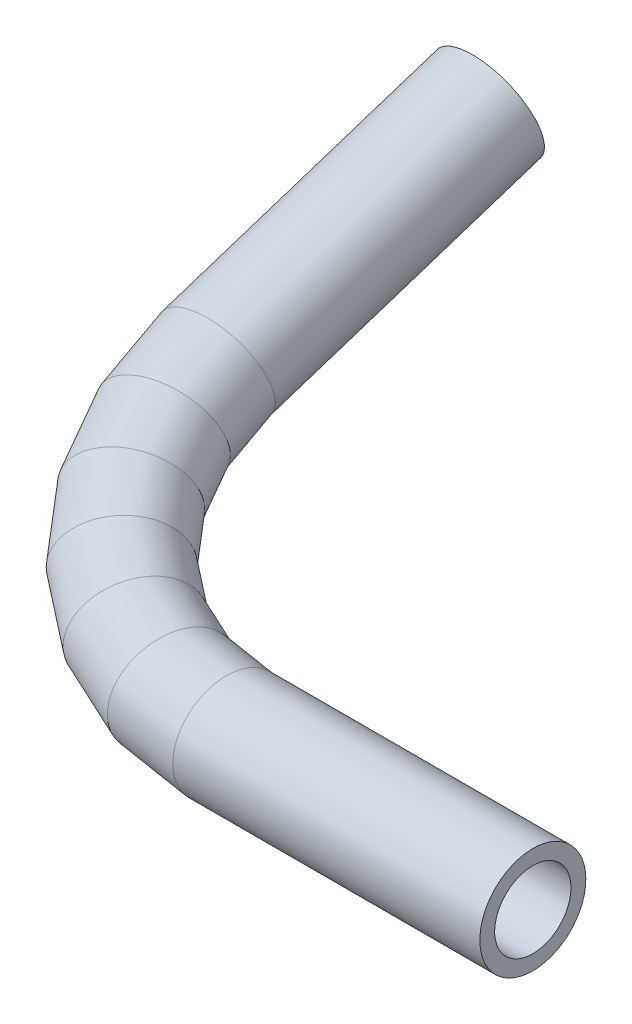
ISO-10303-21;
HEADER;
FILE_DESCRIPTION(('STEP AP214'),'2;1');
FILE_NAME('part.step','',(''),(''),'','','');
FILE_SCHEMA(('AUTOMOTIVE_DESIGN { 1 0 10303 214 1 1 1 1 }'));
ENDSEC;
DATA;
#1=APPLICATION_CONTEXT('core data for automotive mechanical design processes');
#2=APPLICATION_PROTOCOL_DEFINITION('international standard','automotive_design',2000,#1);
#3=PRODUCT_CONTEXT('',#1,'mechanical');
#4=PRODUCT('Part','Part','',(#3));
#5=PRODUCT_RELATED_PRODUCT_CATEGORY('part','',(#4));
#6=PRODUCT_DEFINITION_FORMATION('','',#4);
#7=PRODUCT_DEFINITION_CONTEXT('part definition',#1,'design');
#8=PRODUCT_DEFINITION('design','',#6,#7);
#9=PRODUCT_DEFINITION_SHAPE('','',#8);
#10=(LENGTH_UNIT() NAMED_UNIT(*) SI_UNIT(.MILLI.,.METRE.));
#11=(NAMED_UNIT(*) PLANE_ANGLE_UNIT() SI_UNIT($,.RADIAN.));
#12=(NAMED_UNIT(*) SI_UNIT($,.STERADIAN.) SOLID_ANGLE_UNIT());
#13=UNCERTAINTY_MEASURE_WITH_UNIT(LENGTH_MEASURE(1.E-05),#10,'distance_accuracy_value','');
#14=(GEOMETRIC_REPRESENTATION_CONTEXT(3) GLOBAL_UNCERTAINTY_ASSIGNED_CONTEXT((#13)) GLOBAL_UNIT_ASSIGNED_CONTEXT((#10,
#11,#12)) REPRESENTATION_CONTEXT('',''));
#15=CARTESIAN_POINT('',(0.,0.,0.));
#16=DIRECTION('',(0.,0.,1.));
#17=DIRECTION('',(1.,0.,0.));
#18=AXIS2_PLACEMENT_3D('',#15,#16,#17);
#19=CARTESIAN_POINT('',(-2788.09277838077,14.6909208859762,-45.2140053567121));
#20=DIRECTION('',(0.,0.309016994374947,-0.951056516295154));
#21=DIRECTION('',(0.,0.951056516295154,0.309016994374947));
#22=AXIS2_PLACEMENT_3D('',#19,#20,#21);
#23=CYLINDRICAL_SURFACE('',#22,3.175);
#24=CARTESIAN_POINT('',(-2788.09277838077,14.8328157299977,-45.6507127821673));
#25=DIRECTION('',(-0.0654031292301812,0.308355365269414,-0.949020231289337));
#26=DIRECTION('',(-0.997858923238601,-0.020210678417426,0.0622020722404581));
#27=AXIS2_PLACEMENT_3D('',#24,#25,#26);
#28=ELLIPSE('',#27,3.18181250481318,3.175);
#29=CARTESIAN_POINT('',(-2791.26777838077,14.7685091406784,-45.4527974508873));
#30=VERTEX_POINT('',#29);
#31=EDGE_CURVE('E45',#30,#30,#28,.T.);
#32=ORIENTED_EDGE('',*,*,#31,.T.);
#33=EDGE_LOOP('',(#32));
#34=FACE_BOUND('',#33,.T.);
#35=CARTESIAN_POINT('',(-2788.09277838077,20.1324571835282,-61.9613320366295));
#36=DIRECTION('',(0.,-0.309016994374947,0.951056516295153));
#37=DIRECTION('',(0.951056516295153,-0.293892626146236,-0.0954915028125263));
#38=AXIS2_PLACEMENT_3D('',#35,#36,#37);
#39=CIRCLE('',#38,3.175);
#40=CARTESIAN_POINT('',(-2785.07317394154,19.1993480955139,-62.2645175580592));
#41=VERTEX_POINT('',#40);
#42=EDGE_CURVE('E80',#41,#41,#39,.T.);
#43=ORIENTED_EDGE('',*,*,#42,.T.);
#44=EDGE_LOOP('',(#43));
#45=FACE_BOUND('',#44,.T.);
#46=ADVANCED_FACE('F39',(#34,#45),#23,.T.);
#47=CARTESIAN_POINT('',(-2787.47444345728,13.3814494203848,-41.1838665846607));
#48=DIRECTION('',(-0.130526192220127,0.306373311150218,-0.942920095956898));
#49=DIRECTION('',(0.,0.951056516295154,0.309016994374947));
#50=AXIS2_PLACEMENT_3D('',#47,#48,#49);
#51=CYLINDRICAL_SURFACE('',#50,3.175);
#52=CARTESIAN_POINT('',(-2787.58166577511,13.6331234789292,-41.9584396913767));
#53=DIRECTION('',(-0.258819045102505,0.298487495628986,-0.918650051350003));
#54=DIRECTION('',(-0.965925826289073,-0.0799794834045703,0.246151539386026));
#55=AXIS2_PLACEMENT_3D('',#52,#53,#54);
#56=ELLIPSE('',#55,3.20239694984194,3.175);
#57=CARTESIAN_POINT('',(-2790.67494369499,13.3769974252245,-41.170164752448));
#58=VERTEX_POINT('',#57);
#59=EDGE_CURVE('E94',#58,#58,#56,.T.);
#60=ORIENTED_EDGE('',*,*,#59,.T.);
#61=EDGE_LOOP('',(#60));
#62=FACE_BOUND('',#61,.T.);
#63=ORIENTED_EDGE('',*,*,#31,.F.);
#64=EDGE_LOOP('',(#63));
#65=FACE_BOUND('',#64,.T.);
#66=ADVANCED_FACE('F103',(#62,#65),#51,.T.);
#67=CARTESIAN_POINT('',(-2785.76879950782,12.2806653848199,-37.7960016804169));
#68=DIRECTION('',(-0.382683432364989,0.285494476301182,-0.878661649666619));
#69=DIRECTION('',(-0.916819345772618,0.,0.399302250453298));
#70=AXIS2_PLACEMENT_3D('',#67,#68,#69);
#71=CYLINDRICAL_SURFACE('',#70,3.175);
#72=CARTESIAN_POINT('',(-2786.08315943754,12.5151882721855,-38.5177889099539));
#73=DIRECTION('',(-0.499999999999964,0.267616567329824,-0.823639103546352));
#74=DIRECTION('',(-0.866025403784459,-0.154508497187461,0.475528258147543));
#75=AXIS2_PLACEMENT_3D('',#72,#73,#74);
#76=ELLIPSE('',#75,3.20239694984201,3.175);
#77=CARTESIAN_POINT('',(-2788.85651654911,12.0203907320677,-36.9949586664986));
#78=VERTEX_POINT('',#77);
#79=EDGE_CURVE('E95',#78,#78,#76,.T.);
#80=ORIENTED_EDGE('',*,*,#79,.T.);
#81=EDGE_LOOP('',(#80));
#82=FACE_BOUND('',#81,.T.);
#83=ORIENTED_EDGE('',*,*,#59,.F.);
#84=EDGE_LOOP('',(#83));
#85=FACE_BOUND('',#84,.T.);
#86=ADVANCED_FACE('F104',(#82,#85),#71,.T.);
#87=CARTESIAN_POINT('',(-2783.19930566667,11.353806177651,-34.9434223572351));
#88=DIRECTION('',(-0.608761429008741,0.245159664694118,-0.75452386400849));
#89=DIRECTION('',(-0.778274692967016,0.,0.627923962185786));
#90=AXIS2_PLACEMENT_3D('',#87,#88,#89);
#91=CYLINDRICAL_SURFACE('',#90,3.175);
#92=CARTESIAN_POINT('',(-2783.69938009857,11.5551955466314,-35.5632351027085));
#93=DIRECTION('',(-0.70710678118655,0.21850801222441,-0.672498511963955));
#94=DIRECTION('',(-0.707106781186545,-0.218508012224411,0.67249851196396));
#95=AXIS2_PLACEMENT_3D('',#92,#93,#94);
#96=ELLIPSE('',#95,3.20239694984197,3.175);
#97=CARTESIAN_POINT('',(-2785.96381669786,10.855446154768,-33.4096279192219));
#98=VERTEX_POINT('',#97);
#99=EDGE_CURVE('E90',#98,#98,#96,.T.);
#100=ORIENTED_EDGE('',*,*,#99,.T.);
#101=EDGE_LOOP('',(#100));
#102=FACE_BOUND('',#101,.T.);
#103=ORIENTED_EDGE('',*,*,#79,.F.);
#104=EDGE_LOOP('',(#103));
#105=FACE_BOUND('',#104,.T.);
#106=ADVANCED_FACE('F109',(#102,#105),#91,.T.);
#107=CARTESIAN_POINT('',(-2779.94106869281,10.6640357221396,-32.820527181878));
#108=DIRECTION('',(-0.793353340291224,0.188117627083678,-0.578966523927908));
#109=DIRECTION('',(-0.589490998187472,0.,0.807774945796128));
#110=AXIS2_PLACEMENT_3D('',#107,#108,#109);
#111=CYLINDRICAL_SURFACE('',#110,3.175);
#112=CARTESIAN_POINT('',(-2780.59277838077,10.8185672200503,-33.2961262289724));
#113=DIRECTION('',(-0.866025403784438,0.154508497187474,-0.475528258147578));
#114=DIRECTION('',(-0.500000000000001,-0.267616567329821,0.82363910354633));
#115=AXIS2_PLACEMENT_3D('',#112,#113,#114);
#116=ELLIPSE('',#115,3.20239694984199,3.175);
#117=CARTESIAN_POINT('',(-2782.1939768557,9.96155274110606,-30.658506876005));
#118=VERTEX_POINT('',#117);
#119=EDGE_CURVE('E88',#118,#118,#116,.T.);
#120=ORIENTED_EDGE('',*,*,#119,.T.);
#121=EDGE_LOOP('',(#120));
#122=FACE_BOUND('',#121,.T.);
#123=ORIENTED_EDGE('',*,*,#99,.F.);
#124=EDGE_LOOP('',(#123));
#125=FACE_BOUND('',#124,.T.);
#126=ADVANCED_FACE('F169',(#122,#125),#111,.T.);
#127=CARTESIAN_POINT('',(-2776.21613205152,10.258360734929,-31.5719879522958));
#128=DIRECTION('',(-0.923879532511293,0.118255684066543,-0.363953572029001));
#129=DIRECTION('',(-0.366525415369673,0.,0.930408039458005));
#130=AXIS2_PLACEMENT_3D('',#127,#128,#129);
#131=CYLINDRICAL_SURFACE('',#130,3.175);
#132=CARTESIAN_POINT('',(-2776.97506405731,10.3555032955627,-31.8709620119173));
#133=DIRECTION('',(-0.965925826289071,0.0799794834045717,-0.246151539386032));
#134=DIRECTION('',(-0.258819045102511,-0.298487495628982,0.918650051350003));
#135=AXIS2_PLACEMENT_3D('',#132,#133,#134);
#136=ELLIPSE('',#135,3.20239694984198,3.175);
#137=CARTESIAN_POINT('',(-2777.80390537791,9.39962784999446,-28.9290798895019));
#138=VERTEX_POINT('',#137);
#139=EDGE_CURVE('E85',#138,#138,#136,.T.);
#140=ORIENTED_EDGE('',*,*,#139,.T.);
#141=EDGE_LOOP('',(#140));
#142=FACE_BOUND('',#141,.T.);
#143=ORIENTED_EDGE('',*,*,#119,.F.);
#144=EDGE_LOOP('',(#143));
#145=FACE_BOUND('',#144,.T.);
#146=ADVANCED_FACE('F163',(#142,#145),#131,.T.);
#147=CARTESIAN_POINT('',(-2772.63752538006,10.1790398206875,-31.3278632803812));
#148=DIRECTION('',(-0.991444861373811,0.0403348116070459,-0.124137785658069));
#149=DIRECTION('',(-0.124238888735265,0.,0.992252336115076));
#150=AXIS2_PLACEMENT_3D('',#147,#148,#149);
#151=CYLINDRICAL_SURFACE('',#150,3.175);
#152=CARTESIAN_POINT('',(-2773.09277838077,10.1975608143733,-31.3848650377401));
#153=DIRECTION('',(-0.997858923238604,0.0202106784174145,-0.0622020722404191));
#154=DIRECTION('',(-0.0654031292301406,-0.308355365269418,0.949020231289338));
#155=AXIS2_PLACEMENT_3D('',#152,#153,#154);
#156=ELLIPSE('',#155,3.18181250481317,3.175);
#157=CARTESIAN_POINT('',(-2773.30087887521,9.21643185723279,-28.365260598503));
#158=VERTEX_POINT('',#157);
#159=EDGE_CURVE('E78',#158,#158,#156,.T.);
#160=ORIENTED_EDGE('',*,*,#159,.T.);
#161=EDGE_LOOP('',(#160));
#162=FACE_BOUND('',#161,.T.);
#163=ORIENTED_EDGE('',*,*,#139,.F.);
#164=EDGE_LOOP('',(#163));
#165=FACE_BOUND('',#164,.T.);
#166=ADVANCED_FACE('F159',(#162,#165),#151,.T.);
#167=CARTESIAN_POINT('',(-2754.89277838077,10.1975608143733,-31.3848650377401));
#168=DIRECTION('',(-1.,0.,0.));
#169=DIRECTION('',(0.,0.,1.));
#170=AXIS2_PLACEMENT_3D('',#167,#168,#169);
#171=CYLINDRICAL_SURFACE('',#170,3.175);
#172=CARTESIAN_POINT('',(-2754.89277838077,10.1975608143733,-31.3848650377401));
#173=DIRECTION('',(1.,0.,0.));
#174=DIRECTION('',(0.,0.,-1.));
#175=AXIS2_PLACEMENT_3D('',#172,#173,#174);
#176=CIRCLE('',#175,3.175);
#177=CARTESIAN_POINT('',(-2754.89277838077,10.1975608143733,-34.5598650377401));
#178=VERTEX_POINT('',#177);
#179=EDGE_CURVE('E74',#178,#178,#176,.T.);
#180=ORIENTED_EDGE('',*,*,#179,.F.);
#181=EDGE_LOOP('',(#180));
#182=FACE_BOUND('',#181,.T.);
#183=ORIENTED_EDGE('',*,*,#159,.F.);
#184=EDGE_LOOP('',(#183));
#185=FACE_BOUND('',#184,.T.);
#186=ADVANCED_FACE('F156',(#182,#185),#171,.T.);
#187=CARTESIAN_POINT('',(-2788.09277838077,20.1324571835282,-61.9613320366295));
#188=DIRECTION('',(0.,-0.309016994374947,0.951056516295153));
#189=DIRECTION('',(0.951056516295153,-0.293892626146236,-0.0954915028125263));
#190=AXIS2_PLACEMENT_3D('',#187,#188,#189);
#191=PLANE('',#190);
#192=CARTESIAN_POINT('',(-2788.09277838077,20.1324571835282,-61.9613320366295));
#193=DIRECTION('',(0.,-0.309016994374947,0.951056516295153));
#194=DIRECTION('',(0.951056516295153,-0.293892626146236,-0.0954915028125263));
#195=AXIS2_PLACEMENT_3D('',#192,#193,#194);
#196=CIRCLE('',#195,2.286);
#197=CARTESIAN_POINT('',(-2785.91866318452,19.4606186401579,-62.1796256120589));
#198=VERTEX_POINT('',#197);
#199=EDGE_CURVE('E72',#198,#198,#196,.F.);
#200=ORIENTED_EDGE('',*,*,#199,.F.);
#201=EDGE_LOOP('',(#200));
#202=FACE_BOUND('',#201,.T.);
#203=ORIENTED_EDGE('',*,*,#42,.F.);
#204=EDGE_LOOP('',(#203));
#205=FACE_BOUND('',#204,.T.);
#206=ADVANCED_FACE('F155',(#202,#205),#191,.F.);
#207=CARTESIAN_POINT('',(-2754.89277838077,10.1975608143733,-31.3848650377401));
#208=DIRECTION('',(1.,0.,0.));
#209=DIRECTION('',(0.,0.,-1.));
#210=AXIS2_PLACEMENT_3D('',#207,#208,#209);
#211=PLANE('',#210);
#212=CARTESIAN_POINT('',(-2754.89277838077,10.1975608143733,-31.3848650377401));
#213=DIRECTION('',(1.,0.,0.));
#214=DIRECTION('',(0.,0.,-1.));
#215=AXIS2_PLACEMENT_3D('',#212,#213,#214);
#216=CIRCLE('',#215,2.286);
#217=CARTESIAN_POINT('',(-2754.89277838077,10.1975608143733,-33.6708650377401));
#218=VERTEX_POINT('',#217);
#219=EDGE_CURVE('E46',#218,#218,#216,.F.);
#220=ORIENTED_EDGE('',*,*,#219,.T.);
#221=EDGE_LOOP('',(#220));
#222=FACE_BOUND('',#221,.T.);
#223=ORIENTED_EDGE('',*,*,#179,.T.);
#224=EDGE_LOOP('',(#223));
#225=FACE_BOUND('',#224,.T.);
#226=ADVANCED_FACE('F146',(#222,#225),#211,.T.);
#227=CARTESIAN_POINT('',(-2788.09277838077,14.7219989664599,-45.3096538533839));
#228=DIRECTION('',(0.,0.309016994374947,-0.951056516295154));
#229=DIRECTION('',(0.,0.951056516295154,0.309016994374947));
#230=AXIS2_PLACEMENT_3D('',#227,#228,#229);
#231=CYLINDRICAL_SURFACE('',#230,2.286);
#232=CARTESIAN_POINT('',(-2788.09277838077,14.8328157299977,-45.6507127821673));
#233=DIRECTION('',(-0.0654031292301812,0.308355365269414,-0.949020231289337));
#234=DIRECTION('',(-0.997858923238601,-0.0202106784174268,0.0622020722404578));
#235=AXIS2_PLACEMENT_3D('',#232,#233,#234);
#236=ELLIPSE('',#235,2.29090500346549,2.286);
#237=CARTESIAN_POINT('',(-2790.37877838077,14.7865149856878,-45.5082137436457));
#238=VERTEX_POINT('',#237);
#239=EDGE_CURVE('E70',#238,#238,#236,.F.);
#240=ORIENTED_EDGE('',*,*,#239,.T.);
#241=EDGE_LOOP('',(#240));
#242=FACE_BOUND('',#241,.T.);
#243=ORIENTED_EDGE('',*,*,#199,.T.);
#244=EDGE_LOOP('',(#243));
#245=FACE_BOUND('',#244,.T.);
#246=ADVANCED_FACE('F145',(#242,#245),#231,.F.);
#247=CARTESIAN_POINT('',(-2787.50081097289,13.443339704065,-41.3743452918545));
#248=DIRECTION('',(-0.130526192220127,0.306373311150218,-0.942920095956898));
#249=DIRECTION('',(0.,0.951056516295154,0.309016994374947));
#250=AXIS2_PLACEMENT_3D('',#247,#248,#249);
#251=CYLINDRICAL_SURFACE('',#250,2.286);
#252=CARTESIAN_POINT('',(-2787.58166577511,13.6331234789291,-41.9584396913766));
#253=DIRECTION('',(-0.258819045102505,0.298487495628986,-0.918650051350003));
#254=DIRECTION('',(-0.965925826289073,-0.0799794834045703,0.246151539386026));
#255=AXIS2_PLACEMENT_3D('',#252,#253,#254);
#256=ELLIPSE('',#255,2.3057258038862,2.286);
#257=CARTESIAN_POINT('',(-2789.80882587743,13.4487127202617,-41.390881735348));
#258=VERTEX_POINT('',#257);
#259=EDGE_CURVE('E63',#258,#258,#256,.F.);
#260=ORIENTED_EDGE('',*,*,#259,.T.);
#261=EDGE_LOOP('',(#260));
#262=FACE_BOUND('',#261,.T.);
#263=ORIENTED_EDGE('',*,*,#239,.F.);
#264=EDGE_LOOP('',(#263));
#265=FACE_BOUND('',#264,.T.);
#266=ADVANCED_FACE('F138',(#262,#265),#251,.F.);
#267=CARTESIAN_POINT('',(-2785.84610515204,12.3383379479459,-37.9734995784968));
#268=DIRECTION('',(-0.382683432364989,0.285494476301182,-0.87866164966662));
#269=DIRECTION('',(-0.916819345772618,0.,0.399302250453298));
#270=AXIS2_PLACEMENT_3D('',#267,#268,#269);
#271=CYLINDRICAL_SURFACE('',#270,2.286);
#272=CARTESIAN_POINT('',(-2786.08315943754,12.5151882721854,-38.5177889099539));
#273=DIRECTION('',(-0.499999999999964,0.267616567329824,-0.823639103546352));
#274=DIRECTION('',(-0.866025403784459,-0.154508497187461,0.475528258147543));
#275=AXIS2_PLACEMENT_3D('',#272,#273,#274);
#276=ELLIPSE('',#275,2.30572580388625,2.286);
#277=CARTESIAN_POINT('',(-2788.07997655787,12.1589340433006,-37.4213511346661));
#278=VERTEX_POINT('',#277);
#279=EDGE_CURVE('E65',#278,#278,#276,.F.);
#280=ORIENTED_EDGE('',*,*,#279,.T.);
#281=EDGE_LOOP('',(#280));
#282=FACE_BOUND('',#281,.T.);
#283=ORIENTED_EDGE('',*,*,#259,.F.);
#284=EDGE_LOOP('',(#283));
#285=FACE_BOUND('',#284,.T.);
#286=ADVANCED_FACE('F137',(#282,#285),#271,.F.);
#287=CARTESIAN_POINT('',(-2783.32228118759,11.4033307303542,-35.0958432577757));
#288=DIRECTION('',(-0.608761429008741,0.245159664694118,-0.75452386400849));
#289=DIRECTION('',(-0.778274692967016,0.,0.627923962185786));
#290=AXIS2_PLACEMENT_3D('',#287,#288,#289);
#291=CYLINDRICAL_SURFACE('',#290,2.286);
#292=CARTESIAN_POINT('',(-2783.69938009857,11.5551955466314,-35.5632351027084));
#293=DIRECTION('',(-0.70710678118655,0.21850801222441,-0.672498511963955));
#294=DIRECTION('',(-0.707106781186545,-0.218508012224411,0.67249851196396));
#295=AXIS2_PLACEMENT_3D('',#292,#293,#294);
#296=ELLIPSE('',#295,2.30572580388622,2.286);
#297=CARTESIAN_POINT('',(-2785.32977445006,11.0513759844897,-34.012637930598));
#298=VERTEX_POINT('',#297);
#299=EDGE_CURVE('E56',#298,#298,#296,.F.);
#300=ORIENTED_EDGE('',*,*,#299,.T.);
#301=EDGE_LOOP('',(#300));
#302=FACE_BOUND('',#301,.T.);
#303=ORIENTED_EDGE('',*,*,#279,.F.);
#304=EDGE_LOOP('',(#303));
#305=FACE_BOUND('',#304,.T.);
#306=ADVANCED_FACE('F135',(#302,#305),#291,.F.);
#307=CARTESIAN_POINT('',(-2780.10133351191,10.7020372479962,-32.9374838523946));
#308=DIRECTION('',(-0.793353340291224,0.188117627083678,-0.578966523927908));
#309=DIRECTION('',(-0.589490998187472,0.,0.807774945796128));
#310=AXIS2_PLACEMENT_3D('',#307,#308,#309);
#311=CYLINDRICAL_SURFACE('',#310,2.286);
#312=CARTESIAN_POINT('',(-2780.59277838077,10.8185672200503,-33.2961262289725));
#313=DIRECTION('',(-0.866025403784438,0.154508497187474,-0.475528258147578));
#314=DIRECTION('',(-0.500000000000001,-0.267616567329821,0.82363910354633));
#315=AXIS2_PLACEMENT_3D('',#312,#313,#314);
#316=ELLIPSE('',#315,2.30572580388623,2.286);
#317=CARTESIAN_POINT('',(-2781.74564128272,10.2015167952104,-31.397040294836));
#318=VERTEX_POINT('',#317);
#319=EDGE_CURVE('E57',#318,#318,#316,.F.);
#320=ORIENTED_EDGE('',*,*,#319,.T.);
#321=EDGE_LOOP('',(#320));
#322=FACE_BOUND('',#321,.T.);
#323=ORIENTED_EDGE('',*,*,#299,.F.);
#324=EDGE_LOOP('',(#323));
#325=FACE_BOUND('',#324,.T.);
#326=ADVANCED_FACE('F126',(#322,#325),#311,.F.);
#327=CARTESIAN_POINT('',(-2776.40276438623,10.2822494927525,-31.645509988973));
#328=DIRECTION('',(-0.923879532511293,0.118255684066543,-0.363953572029001));
#329=DIRECTION('',(-0.366525415369673,0.,0.930408039458005));
#330=AXIS2_PLACEMENT_3D('',#327,#328,#329);
#331=CYLINDRICAL_SURFACE('',#330,2.286);
#332=CARTESIAN_POINT('',(-2776.97506405731,10.3555032955627,-31.8709620119174));
#333=DIRECTION('',(-0.965925826289071,0.0799794834045717,-0.246151539386032));
#334=DIRECTION('',(-0.258819045102511,-0.298487495628982,0.918650051350003));
#335=AXIS2_PLACEMENT_3D('',#332,#333,#334);
#336=ELLIPSE('',#335,2.30572580388622,2.286);
#337=CARTESIAN_POINT('',(-2777.57182980814,9.66727297475358,-29.7528068837783));
#338=VERTEX_POINT('',#337);
#339=EDGE_CURVE('E51',#338,#338,#336,.F.);
#340=ORIENTED_EDGE('',*,*,#339,.T.);
#341=EDGE_LOOP('',(#340));
#342=FACE_BOUND('',#341,.T.);
#343=ORIENTED_EDGE('',*,*,#319,.F.);
#344=EDGE_LOOP('',(#343));
#345=FACE_BOUND('',#344,.T.);
#346=ADVANCED_FACE('F122',(#342,#345),#331,.F.);
#347=CARTESIAN_POINT('',(-2772.73723576414,10.1830963241945,-31.3403479144433));
#348=DIRECTION('',(-0.991444861373811,0.0403348116070459,-0.124137785658069));
#349=DIRECTION('',(-0.124238888735265,0.,0.992252336115076));
#350=AXIS2_PLACEMENT_3D('',#347,#348,#349);
#351=CYLINDRICAL_SURFACE('',#350,2.286);
#352=CARTESIAN_POINT('',(-2773.09277838077,10.1975608143733,-31.3848650377401));
#353=DIRECTION('',(-0.997858923238604,0.0202106784174146,-0.0622020722404192));
#354=DIRECTION('',(-0.0654031292301406,-0.308355365269418,0.949020231289338));
#355=AXIS2_PLACEMENT_3D('',#352,#353,#354);
#356=ELLIPSE('',#355,2.29090500346548,2.286);
#357=CARTESIAN_POINT('',(-2773.24261073677,9.49114796523212,-29.2107498414894));
#358=VERTEX_POINT('',#357);
#359=EDGE_CURVE('E10',#358,#358,#356,.F.);
#360=ORIENTED_EDGE('',*,*,#359,.T.);
#361=EDGE_LOOP('',(#360));
#362=FACE_BOUND('',#361,.T.);
#363=ORIENTED_EDGE('',*,*,#339,.F.);
#364=EDGE_LOOP('',(#363));
#365=FACE_BOUND('',#364,.T.);
#366=ADVANCED_FACE('F113',(#362,#365),#351,.F.);
#367=CARTESIAN_POINT('',(-2754.89277838077,10.1975608143733,-31.3848650377401));
#368=DIRECTION('',(-1.,0.,0.));
#369=DIRECTION('',(0.,0.,1.));
#370=AXIS2_PLACEMENT_3D('',#367,#368,#369);
#371=CYLINDRICAL_SURFACE('',#370,2.286);
#372=ORIENTED_EDGE('',*,*,#219,.F.);
#373=EDGE_LOOP('',(#372));
#374=FACE_BOUND('',#373,.T.);
#375=ORIENTED_EDGE('',*,*,#359,.F.);
#376=EDGE_LOOP('',(#375));
#377=FACE_BOUND('',#376,.T.);
#378=ADVANCED_FACE('F114',(#374,#377),#371,.F.);
#379=CLOSED_SHELL('',(#46,#66,#86,#106,#126,#146,#166,#186,#206,#226,#246,#266,#286,#306,#326,
#346,#366,#378));
#380=MANIFOLD_SOLID_BREP('B2',#379);
#381=ADVANCED_BREP_SHAPE_REPRESENTATION('',(#18,#380),#14);
#382=SHAPE_DEFINITION_REPRESENTATION(#9,#381);
ENDSEC;
END-ISO-10303-21;
